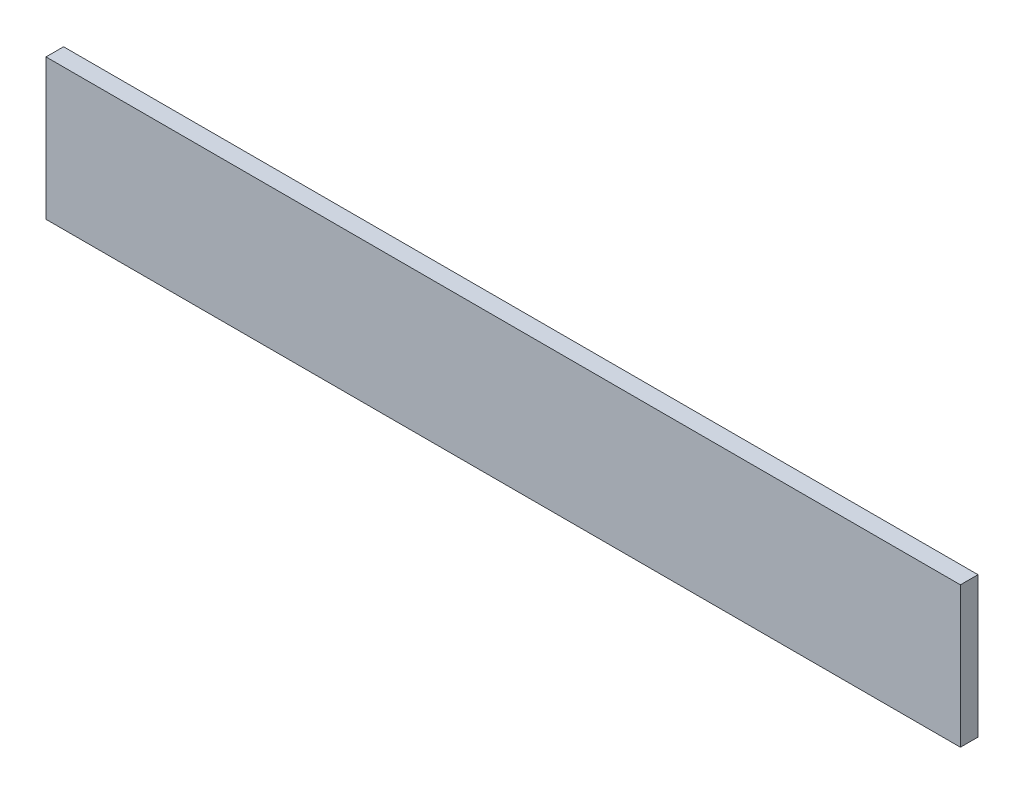
ISO-10303-21;
HEADER;
FILE_DESCRIPTION(('STEP AP214'),'2;1');
FILE_NAME('part.step','',(''),(''),'','','');
FILE_SCHEMA(('AUTOMOTIVE_DESIGN { 1 0 10303 214 1 1 1 1 }'));
ENDSEC;
DATA;
#1=APPLICATION_CONTEXT('core data for automotive mechanical design processes');
#2=APPLICATION_PROTOCOL_DEFINITION('international standard','automotive_design',2000,#1);
#3=PRODUCT_CONTEXT('',#1,'mechanical');
#4=PRODUCT('Part','Part','',(#3));
#5=PRODUCT_RELATED_PRODUCT_CATEGORY('part','',(#4));
#6=PRODUCT_DEFINITION_FORMATION('','',#4);
#7=PRODUCT_DEFINITION_CONTEXT('part definition',#1,'design');
#8=PRODUCT_DEFINITION('design','',#6,#7);
#9=PRODUCT_DEFINITION_SHAPE('','',#8);
#10=(LENGTH_UNIT() NAMED_UNIT(*) SI_UNIT(.MILLI.,.METRE.));
#11=(NAMED_UNIT(*) PLANE_ANGLE_UNIT() SI_UNIT($,.RADIAN.));
#12=(NAMED_UNIT(*) SI_UNIT($,.STERADIAN.) SOLID_ANGLE_UNIT());
#13=UNCERTAINTY_MEASURE_WITH_UNIT(LENGTH_MEASURE(1.E-05),#10,'distance_accuracy_value','');
#14=(GEOMETRIC_REPRESENTATION_CONTEXT(3) GLOBAL_UNCERTAINTY_ASSIGNED_CONTEXT((#13)) GLOBAL_UNIT_ASSIGNED_CONTEXT((#10,
#11,#12)) REPRESENTATION_CONTEXT('',''));
#15=CARTESIAN_POINT('',(0.,0.,0.));
#16=DIRECTION('',(0.,0.,1.));
#17=DIRECTION('',(1.,0.,0.));
#18=AXIS2_PLACEMENT_3D('',#15,#16,#17);
#19=CARTESIAN_POINT('',(3.99999999999999,-4.,0.5));
#20=DIRECTION('',(1.,0.,0.));
#21=DIRECTION('',(0.,1.,0.));
#22=AXIS2_PLACEMENT_3D('',#19,#20,#21);
#23=PLANE('',#22);
#24=DIRECTION('',(0.,-1.,0.));
#25=VECTOR('',#24,1.);
#26=CARTESIAN_POINT('',(3.99999999999999,-4.,0.));
#27=LINE('',#26,#25);
#28=CARTESIAN_POINT('',(3.99999999999999,-4.,0.));
#29=VERTEX_POINT('',#28);
#30=CARTESIAN_POINT('',(3.99999999999999,-8.,0.));
#31=VERTEX_POINT('',#30);
#32=EDGE_CURVE('E111',#29,#31,#27,.T.);
#33=ORIENTED_EDGE('',*,*,#32,.T.);
#34=DIRECTION('',(0.,0.,-1.));
#35=VECTOR('',#34,1.);
#36=CARTESIAN_POINT('',(3.99999999999999,-8.,0.5));
#37=LINE('',#36,#35);
#38=CARTESIAN_POINT('',(3.99999999999999,-8.,0.5));
#39=VERTEX_POINT('',#38);
#40=EDGE_CURVE('E11',#39,#31,#37,.T.);
#41=ORIENTED_EDGE('',*,*,#40,.F.);
#42=DIRECTION('',(0.,-1.,0.));
#43=VECTOR('',#42,1.);
#44=CARTESIAN_POINT('',(3.99999999999999,-4.,0.5));
#45=LINE('',#44,#43);
#46=CARTESIAN_POINT('',(3.99999999999999,-4.,0.5));
#47=VERTEX_POINT('',#46);
#48=EDGE_CURVE('E93',#47,#39,#45,.T.);
#49=ORIENTED_EDGE('',*,*,#48,.F.);
#50=DIRECTION('',(0.,0.,-1.));
#51=VECTOR('',#50,1.);
#52=CARTESIAN_POINT('',(3.99999999999999,-4.,0.5));
#53=LINE('',#52,#51);
#54=EDGE_CURVE('E60',#47,#29,#53,.T.);
#55=ORIENTED_EDGE('',*,*,#54,.T.);
#56=EDGE_LOOP('',(#33,#41,#49,#55));
#57=FACE_BOUND('',#56,.T.);
#58=ADVANCED_FACE('F43',(#57),#23,.F.);
#59=CARTESIAN_POINT('',(3.99999999999999,-8.,0.5));
#60=DIRECTION('',(0.,1.,0.));
#61=DIRECTION('',(0.,0.,1.));
#62=AXIS2_PLACEMENT_3D('',#59,#60,#61);
#63=PLANE('',#62);
#64=DIRECTION('',(1.,0.,0.));
#65=VECTOR('',#64,1.);
#66=CARTESIAN_POINT('',(3.99999999999999,-8.,0.));
#67=LINE('',#66,#65);
#68=CARTESIAN_POINT('',(30.,-8.,0.));
#69=VERTEX_POINT('',#68);
#70=EDGE_CURVE('E99',#31,#69,#67,.T.);
#71=ORIENTED_EDGE('',*,*,#70,.T.);
#72=DIRECTION('',(0.,0.,-1.));
#73=VECTOR('',#72,1.);
#74=CARTESIAN_POINT('',(30.,-8.,0.5));
#75=LINE('',#74,#73);
#76=CARTESIAN_POINT('',(30.,-8.,0.5));
#77=VERTEX_POINT('',#76);
#78=EDGE_CURVE('E52',#77,#69,#75,.T.);
#79=ORIENTED_EDGE('',*,*,#78,.F.);
#80=DIRECTION('',(1.,0.,0.));
#81=VECTOR('',#80,1.);
#82=CARTESIAN_POINT('',(3.99999999999999,-8.,0.5));
#83=LINE('',#82,#81);
#84=EDGE_CURVE('E85',#39,#77,#83,.T.);
#85=ORIENTED_EDGE('',*,*,#84,.F.);
#86=ORIENTED_EDGE('',*,*,#40,.T.);
#87=EDGE_LOOP('',(#71,#79,#85,#86));
#88=FACE_BOUND('',#87,.T.);
#89=ADVANCED_FACE('F98',(#88),#63,.F.);
#90=CARTESIAN_POINT('',(30.,-4.,0.5));
#91=DIRECTION('',(1.,0.,0.));
#92=DIRECTION('',(0.,0.,-1.));
#93=AXIS2_PLACEMENT_3D('',#90,#91,#92);
#94=PLANE('',#93);
#95=DIRECTION('',(0.,-1.,0.));
#96=VECTOR('',#95,1.);
#97=CARTESIAN_POINT('',(30.,-4.,0.));
#98=LINE('',#97,#96);
#99=CARTESIAN_POINT('',(30.,-4.,0.));
#100=VERTEX_POINT('',#99);
#101=EDGE_CURVE('E116',#100,#69,#98,.T.);
#102=ORIENTED_EDGE('',*,*,#101,.F.);
#103=DIRECTION('',(0.,0.,-1.));
#104=VECTOR('',#103,1.);
#105=CARTESIAN_POINT('',(30.,-4.,0.5));
#106=LINE('',#105,#104);
#107=CARTESIAN_POINT('',(30.,-4.,0.5));
#108=VERTEX_POINT('',#107);
#109=EDGE_CURVE('E74',#108,#100,#106,.T.);
#110=ORIENTED_EDGE('',*,*,#109,.F.);
#111=DIRECTION('',(0.,-1.,0.));
#112=VECTOR('',#111,1.);
#113=CARTESIAN_POINT('',(30.,-4.,0.5));
#114=LINE('',#113,#112);
#115=EDGE_CURVE('E92',#108,#77,#114,.T.);
#116=ORIENTED_EDGE('',*,*,#115,.T.);
#117=ORIENTED_EDGE('',*,*,#78,.T.);
#118=EDGE_LOOP('',(#102,#110,#116,#117));
#119=FACE_BOUND('',#118,.T.);
#120=ADVANCED_FACE('F103',(#119),#94,.T.);
#121=CARTESIAN_POINT('',(3.99999999999999,-4.,0.5));
#122=DIRECTION('',(0.,1.,0.));
#123=DIRECTION('',(-1.,0.,0.));
#124=AXIS2_PLACEMENT_3D('',#121,#122,#123);
#125=PLANE('',#124);
#126=DIRECTION('',(1.,0.,0.));
#127=VECTOR('',#126,1.);
#128=CARTESIAN_POINT('',(3.99999999999999,-4.,0.));
#129=LINE('',#128,#127);
#130=EDGE_CURVE('E119',#29,#100,#129,.T.);
#131=ORIENTED_EDGE('',*,*,#130,.F.);
#132=ORIENTED_EDGE('',*,*,#54,.F.);
#133=DIRECTION('',(1.,0.,0.));
#134=VECTOR('',#133,1.);
#135=CARTESIAN_POINT('',(3.99999999999999,-4.,0.5));
#136=LINE('',#135,#134);
#137=EDGE_CURVE('E105',#47,#108,#136,.T.);
#138=ORIENTED_EDGE('',*,*,#137,.T.);
#139=ORIENTED_EDGE('',*,*,#109,.T.);
#140=EDGE_LOOP('',(#131,#132,#138,#139));
#141=FACE_BOUND('',#140,.T.);
#142=ADVANCED_FACE('F129',(#141),#125,.T.);
#143=CARTESIAN_POINT('',(0.,0.,0.5));
#144=DIRECTION('',(0.,0.,1.));
#145=DIRECTION('',(1.,0.,0.));
#146=AXIS2_PLACEMENT_3D('',#143,#144,#145);
#147=PLANE('',#146);
#148=ORIENTED_EDGE('',*,*,#48,.T.);
#149=ORIENTED_EDGE('',*,*,#84,.T.);
#150=ORIENTED_EDGE('',*,*,#115,.F.);
#151=ORIENTED_EDGE('',*,*,#137,.F.);
#152=EDGE_LOOP('',(#148,#149,#150,#151));
#153=FACE_BOUND('',#152,.T.);
#154=ADVANCED_FACE('F89',(#153),#147,.T.);
#155=CARTESIAN_POINT('',(0.,0.,0.));
#156=DIRECTION('',(0.,0.,1.));
#157=DIRECTION('',(1.,0.,0.));
#158=AXIS2_PLACEMENT_3D('',#155,#156,#157);
#159=PLANE('',#158);
#160=ORIENTED_EDGE('',*,*,#32,.F.);
#161=ORIENTED_EDGE('',*,*,#130,.T.);
#162=ORIENTED_EDGE('',*,*,#101,.T.);
#163=ORIENTED_EDGE('',*,*,#70,.F.);
#164=EDGE_LOOP('',(#160,#161,#162,#163));
#165=FACE_BOUND('',#164,.T.);
#166=ADVANCED_FACE('F128',(#165),#159,.F.);
#167=CLOSED_SHELL('',(#58,#89,#120,#142,#154,#166));
#168=MANIFOLD_SOLID_BREP('B2',#167);
#169=ADVANCED_BREP_SHAPE_REPRESENTATION('',(#18,#168),#14);
#170=SHAPE_DEFINITION_REPRESENTATION(#9,#169);
ENDSEC;
END-ISO-10303-21;
